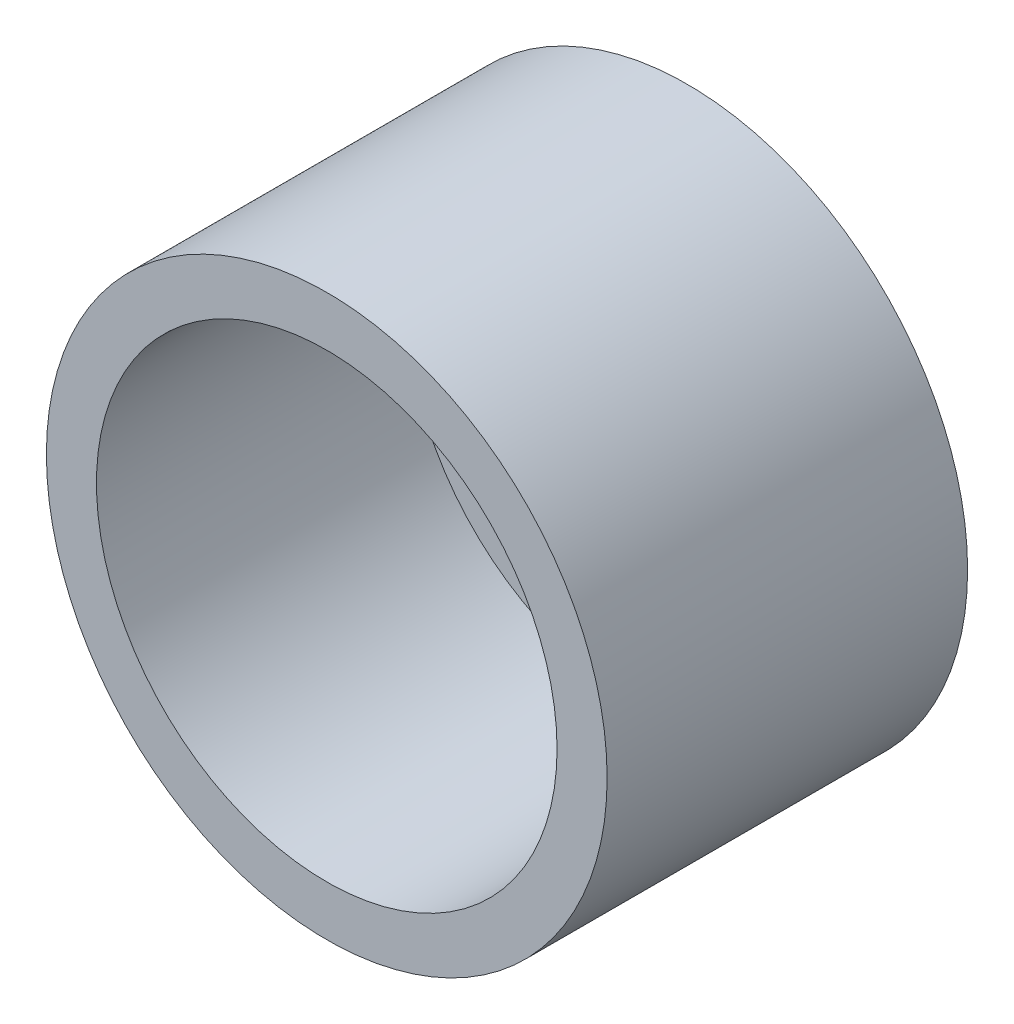
ISO-10303-21;
HEADER;
FILE_DESCRIPTION(('STEP AP214'),'2;1');
FILE_NAME('part.step','',(''),(''),'','','');
FILE_SCHEMA(('AUTOMOTIVE_DESIGN { 1 0 10303 214 1 1 1 1 }'));
ENDSEC;
DATA;
#1=APPLICATION_CONTEXT('core data for automotive mechanical design processes');
#2=APPLICATION_PROTOCOL_DEFINITION('international standard','automotive_design',2000,#1);
#3=PRODUCT_CONTEXT('',#1,'mechanical');
#4=PRODUCT('Part','Part','',(#3));
#5=PRODUCT_RELATED_PRODUCT_CATEGORY('part','',(#4));
#6=PRODUCT_DEFINITION_FORMATION('','',#4);
#7=PRODUCT_DEFINITION_CONTEXT('part definition',#1,'design');
#8=PRODUCT_DEFINITION('design','',#6,#7);
#9=PRODUCT_DEFINITION_SHAPE('','',#8);
#10=(LENGTH_UNIT() NAMED_UNIT(*) SI_UNIT(.MILLI.,.METRE.));
#11=(NAMED_UNIT(*) PLANE_ANGLE_UNIT() SI_UNIT($,.RADIAN.));
#12=(NAMED_UNIT(*) SI_UNIT($,.STERADIAN.) SOLID_ANGLE_UNIT());
#13=UNCERTAINTY_MEASURE_WITH_UNIT(LENGTH_MEASURE(1.E-05),#10,'distance_accuracy_value','');
#14=(GEOMETRIC_REPRESENTATION_CONTEXT(3) GLOBAL_UNCERTAINTY_ASSIGNED_CONTEXT((#13)) GLOBAL_UNIT_ASSIGNED_CONTEXT((#10,
#11,#12)) REPRESENTATION_CONTEXT('',''));
#15=CARTESIAN_POINT('',(0.,0.,0.));
#16=DIRECTION('',(0.,0.,1.));
#17=DIRECTION('',(1.,0.,0.));
#18=AXIS2_PLACEMENT_3D('',#15,#16,#17);
#19=CARTESIAN_POINT('',(0.,0.,18.));
#20=DIRECTION('',(0.,0.,-1.));
#21=DIRECTION('',(-1.,0.,0.));
#22=AXIS2_PLACEMENT_3D('',#19,#20,#21);
#23=CYLINDRICAL_SURFACE('',#22,14.);
#24=CARTESIAN_POINT('',(0.,0.,18.));
#25=DIRECTION('',(0.,0.,1.));
#26=DIRECTION('',(1.,0.,0.));
#27=AXIS2_PLACEMENT_3D('',#24,#25,#26);
#28=CIRCLE('',#27,14.);
#29=CARTESIAN_POINT('',(14.,0.,18.));
#30=VERTEX_POINT('',#29);
#31=EDGE_CURVE('E10',#30,#30,#28,.T.);
#32=ORIENTED_EDGE('',*,*,#31,.F.);
#33=EDGE_LOOP('',(#32));
#34=FACE_BOUND('',#33,.T.);
#35=CARTESIAN_POINT('',(0.,0.,0.));
#36=DIRECTION('',(0.,0.,1.));
#37=DIRECTION('',(1.,0.,0.));
#38=AXIS2_PLACEMENT_3D('',#35,#36,#37);
#39=CIRCLE('',#38,14.);
#40=CARTESIAN_POINT('',(14.,0.,0.));
#41=VERTEX_POINT('',#40);
#42=EDGE_CURVE('E46',#41,#41,#39,.T.);
#43=ORIENTED_EDGE('',*,*,#42,.T.);
#44=EDGE_LOOP('',(#43));
#45=FACE_BOUND('',#44,.T.);
#46=ADVANCED_FACE('F43',(#34,#45),#23,.T.);
#47=CARTESIAN_POINT('',(0.,0.,18.));
#48=DIRECTION('',(0.,0.,1.));
#49=DIRECTION('',(1.,0.,0.));
#50=AXIS2_PLACEMENT_3D('',#47,#48,#49);
#51=PLANE('',#50);
#52=CARTESIAN_POINT('',(0.,0.,18.));
#53=DIRECTION('',(0.,0.,1.));
#54=DIRECTION('',(1.,0.,0.));
#55=AXIS2_PLACEMENT_3D('',#52,#53,#54);
#56=CIRCLE('',#55,11.5);
#57=CARTESIAN_POINT('',(11.5,0.,18.));
#58=VERTEX_POINT('',#57);
#59=EDGE_CURVE('E53',#58,#58,#56,.T.);
#60=ORIENTED_EDGE('',*,*,#59,.F.);
#61=EDGE_LOOP('',(#60));
#62=FACE_BOUND('',#61,.T.);
#63=ORIENTED_EDGE('',*,*,#31,.T.);
#64=EDGE_LOOP('',(#63));
#65=FACE_BOUND('',#64,.T.);
#66=ADVANCED_FACE('F74',(#62,#65),#51,.T.);
#67=CARTESIAN_POINT('',(0.,0.,0.));
#68=DIRECTION('',(0.,0.,1.));
#69=DIRECTION('',(1.,0.,0.));
#70=AXIS2_PLACEMENT_3D('',#67,#68,#69);
#71=PLANE('',#70);
#72=ORIENTED_EDGE('',*,*,#42,.F.);
#73=EDGE_LOOP('',(#72));
#74=FACE_BOUND('',#73,.T.);
#75=ADVANCED_FACE('F65',(#74),#71,.F.);
#76=CARTESIAN_POINT('',(0.,0.,18.));
#77=DIRECTION('',(0.,0.,-1.));
#78=DIRECTION('',(-1.,0.,0.));
#79=AXIS2_PLACEMENT_3D('',#76,#77,#78);
#80=CYLINDRICAL_SURFACE('',#79,11.5);
#81=ORIENTED_EDGE('',*,*,#59,.T.);
#82=EDGE_LOOP('',(#81));
#83=FACE_BOUND('',#82,.T.);
#84=CARTESIAN_POINT('',(0.,0.,2.5));
#85=DIRECTION('',(0.,0.,1.));
#86=DIRECTION('',(1.,0.,0.));
#87=AXIS2_PLACEMENT_3D('',#84,#85,#86);
#88=CIRCLE('',#87,11.5);
#89=CARTESIAN_POINT('',(11.5,0.,2.5));
#90=VERTEX_POINT('',#89);
#91=EDGE_CURVE('E57',#90,#90,#88,.T.);
#92=ORIENTED_EDGE('',*,*,#91,.F.);
#93=EDGE_LOOP('',(#92));
#94=FACE_BOUND('',#93,.T.);
#95=ADVANCED_FACE('F63',(#83,#94),#80,.F.);
#96=CARTESIAN_POINT('',(0.,0.,2.5));
#97=DIRECTION('',(0.,0.,1.));
#98=DIRECTION('',(1.,0.,0.));
#99=AXIS2_PLACEMENT_3D('',#96,#97,#98);
#100=PLANE('',#99);
#101=ORIENTED_EDGE('',*,*,#91,.T.);
#102=EDGE_LOOP('',(#101));
#103=FACE_BOUND('',#102,.T.);
#104=ADVANCED_FACE('F61',(#103),#100,.T.);
#105=CLOSED_SHELL('',(#46,#66,#75,#95,#104));
#106=MANIFOLD_SOLID_BREP('B2',#105);
#107=ADVANCED_BREP_SHAPE_REPRESENTATION('',(#18,#106),#14);
#108=SHAPE_DEFINITION_REPRESENTATION(#9,#107);
ENDSEC;
END-ISO-10303-21;
